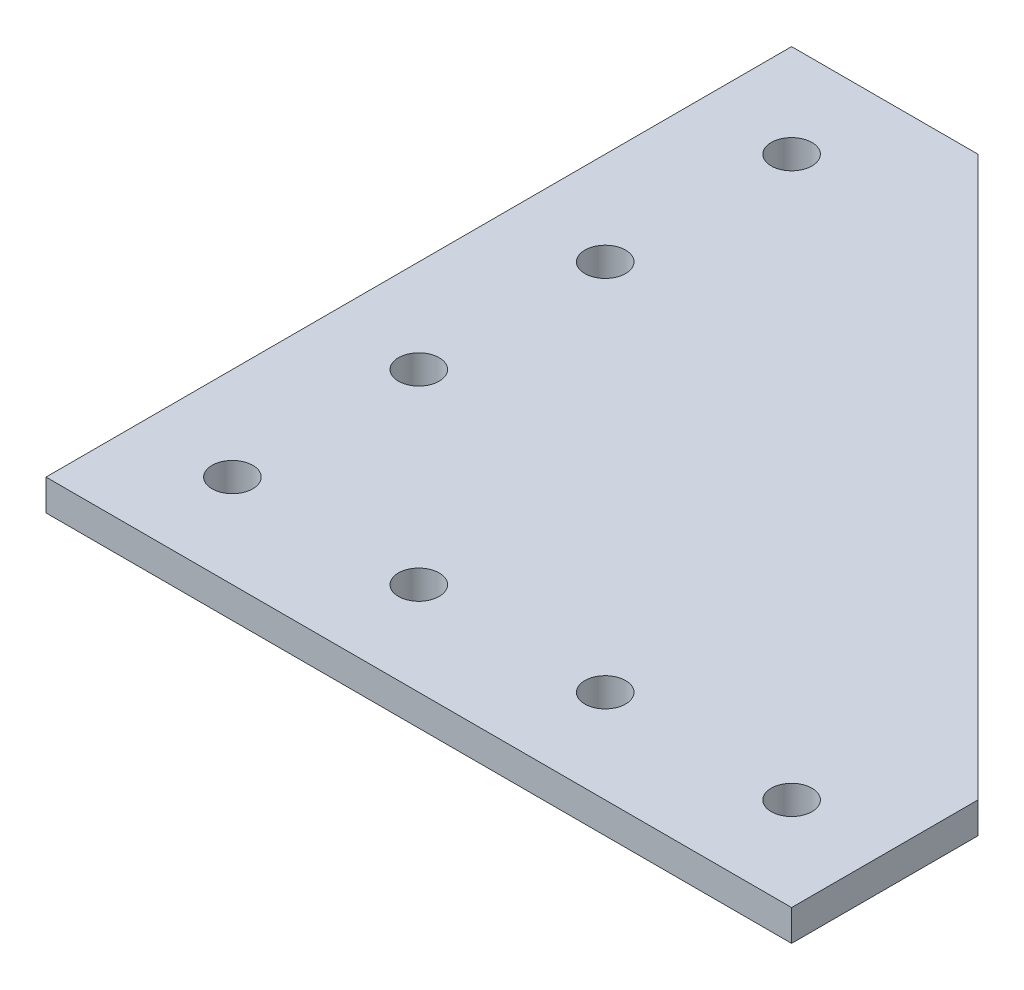
ISO-10303-21;
HEADER;
FILE_DESCRIPTION(('STEP AP214'),'2;1');
FILE_NAME('part.step','',(''),(''),'','','');
FILE_SCHEMA(('AUTOMOTIVE_DESIGN { 1 0 10303 214 1 1 1 1 }'));
ENDSEC;
DATA;
#1=APPLICATION_CONTEXT('core data for automotive mechanical design processes');
#2=APPLICATION_PROTOCOL_DEFINITION('international standard','automotive_design',2000,#1);
#3=PRODUCT_CONTEXT('',#1,'mechanical');
#4=PRODUCT('Part','Part','',(#3));
#5=PRODUCT_RELATED_PRODUCT_CATEGORY('part','',(#4));
#6=PRODUCT_DEFINITION_FORMATION('','',#4);
#7=PRODUCT_DEFINITION_CONTEXT('part definition',#1,'design');
#8=PRODUCT_DEFINITION('design','',#6,#7);
#9=PRODUCT_DEFINITION_SHAPE('','',#8);
#10=(LENGTH_UNIT() NAMED_UNIT(*) SI_UNIT(.MILLI.,.METRE.));
#11=(NAMED_UNIT(*) PLANE_ANGLE_UNIT() SI_UNIT($,.RADIAN.));
#12=(NAMED_UNIT(*) SI_UNIT($,.STERADIAN.) SOLID_ANGLE_UNIT());
#13=UNCERTAINTY_MEASURE_WITH_UNIT(LENGTH_MEASURE(1.E-05),#10,'distance_accuracy_value','');
#14=(GEOMETRIC_REPRESENTATION_CONTEXT(3) GLOBAL_UNCERTAINTY_ASSIGNED_CONTEXT((#13)) GLOBAL_UNIT_ASSIGNED_CONTEXT((#10,
#11,#12)) REPRESENTATION_CONTEXT('',''));
#15=CARTESIAN_POINT('',(0.,0.,0.));
#16=DIRECTION('',(0.,0.,1.));
#17=DIRECTION('',(1.,0.,0.));
#18=AXIS2_PLACEMENT_3D('',#15,#16,#17);
#19=CARTESIAN_POINT('',(0.,6.35,0.));
#20=DIRECTION('',(0.,1.,0.));
#21=DIRECTION('',(0.,0.,1.));
#22=AXIS2_PLACEMENT_3D('',#19,#20,#21);
#23=PLANE('',#22);
#24=CARTESIAN_POINT('',(-8.05206185566881,6.35,28.4768041237114));
#25=DIRECTION('',(0.,1.,0.));
#26=DIRECTION('',(0.,0.,1.));
#27=AXIS2_PLACEMENT_3D('',#24,#25,#26);
#28=CIRCLE('',#27,4.1656);
#29=CARTESIAN_POINT('',(-8.05206185566881,6.35,32.6424041237114));
#30=VERTEX_POINT('',#29);
#31=EDGE_CURVE('E205',#30,#30,#28,.T.);
#32=ORIENTED_EDGE('',*,*,#31,.F.);
#33=EDGE_LOOP('',(#32));
#34=FACE_BOUND('',#33,.T.);
#35=CARTESIAN_POINT('',(-84.2520618556688,6.35,28.4768041237114));
#36=DIRECTION('',(0.,1.,0.));
#37=DIRECTION('',(0.,0.,1.));
#38=AXIS2_PLACEMENT_3D('',#35,#36,#37);
#39=CIRCLE('',#38,4.1656);
#40=CARTESIAN_POINT('',(-84.2520618556688,6.35,32.6424041237114));
#41=VERTEX_POINT('',#40);
#42=EDGE_CURVE('E221',#41,#41,#39,.T.);
#43=ORIENTED_EDGE('',*,*,#42,.F.);
#44=EDGE_LOOP('',(#43));
#45=FACE_BOUND('',#44,.T.);
#46=CARTESIAN_POINT('',(-84.2520618556696,6.35,-47.7231958762887));
#47=DIRECTION('',(0.,1.,0.));
#48=DIRECTION('',(0.,0.,1.));
#49=AXIS2_PLACEMENT_3D('',#46,#47,#48);
#50=CIRCLE('',#49,4.1656);
#51=CARTESIAN_POINT('',(-84.2520618556696,6.35,-43.5575958762887));
#52=VERTEX_POINT('',#51);
#53=EDGE_CURVE('E237',#52,#52,#50,.T.);
#54=ORIENTED_EDGE('',*,*,#53,.F.);
#55=EDGE_LOOP('',(#54));
#56=FACE_BOUND('',#55,.T.);
#57=DIRECTION('',(-1.,0.,0.));
#58=VECTOR('',#57,1.);
#59=CARTESIAN_POINT('',(-65.20206185567,6.35,-104.873195876289));
#60=LINE('',#59,#58);
#61=CARTESIAN_POINT('',(-65.20206185567,6.35,-104.873195876289));
#62=VERTEX_POINT('',#61);
#63=CARTESIAN_POINT('',(-103.30206185567,6.35,-104.873195876289));
#64=VERTEX_POINT('',#63);
#65=EDGE_CURVE('E133',#62,#64,#60,.T.);
#66=ORIENTED_EDGE('',*,*,#65,.T.);
#67=DIRECTION('',(0.,0.,1.));
#68=VECTOR('',#67,1.);
#69=CARTESIAN_POINT('',(-103.30206185567,6.35,-104.873195876289));
#70=LINE('',#69,#68);
#71=CARTESIAN_POINT('',(-103.30206185567,6.35,47.5268041237114));
#72=VERTEX_POINT('',#71);
#73=EDGE_CURVE('E91',#64,#72,#70,.T.);
#74=ORIENTED_EDGE('',*,*,#73,.T.);
#75=DIRECTION('',(1.,0.,0.));
#76=VECTOR('',#75,1.);
#77=CARTESIAN_POINT('',(-103.30206185567,6.35,47.5268041237114));
#78=LINE('',#77,#76);
#79=CARTESIAN_POINT('',(49.09793814433,6.35,47.5268041237114));
#80=VERTEX_POINT('',#79);
#81=EDGE_CURVE('E95',#72,#80,#78,.T.);
#82=ORIENTED_EDGE('',*,*,#81,.T.);
#83=DIRECTION('',(0.,0.,-1.));
#84=VECTOR('',#83,1.);
#85=CARTESIAN_POINT('',(49.09793814433,6.35,47.5268041237114));
#86=LINE('',#85,#84);
#87=CARTESIAN_POINT('',(49.09793814433,6.35,9.42680412371135));
#88=VERTEX_POINT('',#87);
#89=EDGE_CURVE('E99',#80,#88,#86,.T.);
#90=ORIENTED_EDGE('',*,*,#89,.T.);
#91=DIRECTION('',(-0.707106781186548,0.,-0.707106781186548));
#92=VECTOR('',#91,1.);
#93=CARTESIAN_POINT('',(49.09793814433,6.35,9.42680412371135));
#94=LINE('',#93,#92);
#95=EDGE_CURVE('E57',#88,#62,#94,.T.);
#96=ORIENTED_EDGE('',*,*,#95,.T.);
#97=EDGE_LOOP('',(#66,#74,#82,#90,#96));
#98=FACE_BOUND('',#97,.T.);
#99=CARTESIAN_POINT('',(-84.25206185567,6.35,-85.8231958762887));
#100=DIRECTION('',(0.,1.,0.));
#101=DIRECTION('',(0.,0.,1.));
#102=AXIS2_PLACEMENT_3D('',#99,#100,#101);
#103=CIRCLE('',#102,4.1656);
#104=CARTESIAN_POINT('',(-84.25206185567,6.35,-81.6575958762887));
#105=VERTEX_POINT('',#104);
#106=EDGE_CURVE('E124',#105,#105,#103,.T.);
#107=ORIENTED_EDGE('',*,*,#106,.F.);
#108=EDGE_LOOP('',(#107));
#109=FACE_BOUND('',#108,.T.);
#110=CARTESIAN_POINT('',(-84.2520618556692,6.35,-9.62319587628865));
#111=DIRECTION('',(0.,1.,0.));
#112=DIRECTION('',(0.,0.,1.));
#113=AXIS2_PLACEMENT_3D('',#110,#111,#112);
#114=CIRCLE('',#113,4.1656);
#115=CARTESIAN_POINT('',(-84.2520618556692,6.35,-5.45759587628865));
#116=VERTEX_POINT('',#115);
#117=EDGE_CURVE('E229',#116,#116,#114,.T.);
#118=ORIENTED_EDGE('',*,*,#117,.F.);
#119=EDGE_LOOP('',(#118));
#120=FACE_BOUND('',#119,.T.);
#121=CARTESIAN_POINT('',(-46.1520618556688,6.35,28.4768041237114));
#122=DIRECTION('',(0.,1.,0.));
#123=DIRECTION('',(0.,0.,1.));
#124=AXIS2_PLACEMENT_3D('',#121,#122,#123);
#125=CIRCLE('',#124,4.1656);
#126=CARTESIAN_POINT('',(-46.1520618556688,6.35,32.6424041237114));
#127=VERTEX_POINT('',#126);
#128=EDGE_CURVE('E213',#127,#127,#125,.T.);
#129=ORIENTED_EDGE('',*,*,#128,.F.);
#130=EDGE_LOOP('',(#129));
#131=FACE_BOUND('',#130,.T.);
#132=CARTESIAN_POINT('',(30.0479381443312,6.35,28.4768041237114));
#133=DIRECTION('',(0.,1.,0.));
#134=DIRECTION('',(0.,0.,1.));
#135=AXIS2_PLACEMENT_3D('',#132,#133,#134);
#136=CIRCLE('',#135,4.1656);
#137=CARTESIAN_POINT('',(30.0479381443312,6.35,32.6424041237114));
#138=VERTEX_POINT('',#137);
#139=EDGE_CURVE('E194',#138,#138,#136,.T.);
#140=ORIENTED_EDGE('',*,*,#139,.F.);
#141=EDGE_LOOP('',(#140));
#142=FACE_BOUND('',#141,.T.);
#143=ADVANCED_FACE('F39',(#34,#45,#56,#98,#109,#120,#131,#142),#23,.T.);
#144=CARTESIAN_POINT('',(0.,0.,0.));
#145=DIRECTION('',(0.,1.,0.));
#146=DIRECTION('',(0.,0.,1.));
#147=AXIS2_PLACEMENT_3D('',#144,#145,#146);
#148=PLANE('',#147);
#149=DIRECTION('',(-1.,0.,0.));
#150=VECTOR('',#149,1.);
#151=CARTESIAN_POINT('',(-65.20206185567,0.,-104.873195876289));
#152=LINE('',#151,#150);
#153=CARTESIAN_POINT('',(-65.20206185567,0.,-104.873195876289));
#154=VERTEX_POINT('',#153);
#155=CARTESIAN_POINT('',(-103.30206185567,0.,-104.873195876289));
#156=VERTEX_POINT('',#155);
#157=EDGE_CURVE('E119',#154,#156,#152,.T.);
#158=ORIENTED_EDGE('',*,*,#157,.F.);
#159=DIRECTION('',(-0.707106781186548,0.,-0.707106781186548));
#160=VECTOR('',#159,1.);
#161=CARTESIAN_POINT('',(49.09793814433,0.,9.42680412371135));
#162=LINE('',#161,#160);
#163=CARTESIAN_POINT('',(49.09793814433,0.,9.42680412371135));
#164=VERTEX_POINT('',#163);
#165=EDGE_CURVE('E83',#164,#154,#162,.T.);
#166=ORIENTED_EDGE('',*,*,#165,.F.);
#167=DIRECTION('',(0.,0.,-1.));
#168=VECTOR('',#167,1.);
#169=CARTESIAN_POINT('',(49.09793814433,0.,47.5268041237114));
#170=LINE('',#169,#168);
#171=CARTESIAN_POINT('',(49.09793814433,0.,47.5268041237114));
#172=VERTEX_POINT('',#171);
#173=EDGE_CURVE('E77',#172,#164,#170,.T.);
#174=ORIENTED_EDGE('',*,*,#173,.F.);
#175=DIRECTION('',(1.,0.,0.));
#176=VECTOR('',#175,1.);
#177=CARTESIAN_POINT('',(-103.30206185567,0.,47.5268041237114));
#178=LINE('',#177,#176);
#179=CARTESIAN_POINT('',(-103.30206185567,0.,47.5268041237114));
#180=VERTEX_POINT('',#179);
#181=EDGE_CURVE('E107',#180,#172,#178,.T.);
#182=ORIENTED_EDGE('',*,*,#181,.F.);
#183=DIRECTION('',(0.,0.,1.));
#184=VECTOR('',#183,1.);
#185=CARTESIAN_POINT('',(-103.30206185567,0.,-104.873195876289));
#186=LINE('',#185,#184);
#187=EDGE_CURVE('E123',#156,#180,#186,.T.);
#188=ORIENTED_EDGE('',*,*,#187,.F.);
#189=EDGE_LOOP('',(#158,#166,#174,#182,#188));
#190=FACE_BOUND('',#189,.T.);
#191=CARTESIAN_POINT('',(-84.25206185567,0.,-85.8231958762887));
#192=DIRECTION('',(0.,1.,0.));
#193=DIRECTION('',(0.,0.,1.));
#194=AXIS2_PLACEMENT_3D('',#191,#192,#193);
#195=CIRCLE('',#194,4.1656);
#196=CARTESIAN_POINT('',(-84.25206185567,0.,-81.6575958762887));
#197=VERTEX_POINT('',#196);
#198=EDGE_CURVE('E241',#197,#197,#195,.T.);
#199=ORIENTED_EDGE('',*,*,#198,.T.);
#200=EDGE_LOOP('',(#199));
#201=FACE_BOUND('',#200,.T.);
#202=CARTESIAN_POINT('',(-84.2520618556696,0.,-47.7231958762887));
#203=DIRECTION('',(0.,1.,0.));
#204=DIRECTION('',(0.,0.,1.));
#205=AXIS2_PLACEMENT_3D('',#202,#203,#204);
#206=CIRCLE('',#205,4.1656);
#207=CARTESIAN_POINT('',(-84.2520618556696,0.,-43.5575958762887));
#208=VERTEX_POINT('',#207);
#209=EDGE_CURVE('E233',#208,#208,#206,.T.);
#210=ORIENTED_EDGE('',*,*,#209,.T.);
#211=EDGE_LOOP('',(#210));
#212=FACE_BOUND('',#211,.T.);
#213=CARTESIAN_POINT('',(-84.2520618556692,0.,-9.62319587628865));
#214=DIRECTION('',(0.,1.,0.));
#215=DIRECTION('',(0.,0.,1.));
#216=AXIS2_PLACEMENT_3D('',#213,#214,#215);
#217=CIRCLE('',#216,4.1656);
#218=CARTESIAN_POINT('',(-84.2520618556692,0.,-5.45759587628865));
#219=VERTEX_POINT('',#218);
#220=EDGE_CURVE('E225',#219,#219,#217,.T.);
#221=ORIENTED_EDGE('',*,*,#220,.T.);
#222=EDGE_LOOP('',(#221));
#223=FACE_BOUND('',#222,.T.);
#224=CARTESIAN_POINT('',(-84.2520618556688,0.,28.4768041237114));
#225=DIRECTION('',(0.,1.,0.));
#226=DIRECTION('',(0.,0.,1.));
#227=AXIS2_PLACEMENT_3D('',#224,#225,#226);
#228=CIRCLE('',#227,4.1656);
#229=CARTESIAN_POINT('',(-84.2520618556688,0.,32.6424041237114));
#230=VERTEX_POINT('',#229);
#231=EDGE_CURVE('E217',#230,#230,#228,.T.);
#232=ORIENTED_EDGE('',*,*,#231,.T.);
#233=EDGE_LOOP('',(#232));
#234=FACE_BOUND('',#233,.T.);
#235=CARTESIAN_POINT('',(-46.1520618556688,0.,28.4768041237114));
#236=DIRECTION('',(0.,1.,0.));
#237=DIRECTION('',(0.,0.,1.));
#238=AXIS2_PLACEMENT_3D('',#235,#236,#237);
#239=CIRCLE('',#238,4.1656);
#240=CARTESIAN_POINT('',(-46.1520618556688,0.,32.6424041237114));
#241=VERTEX_POINT('',#240);
#242=EDGE_CURVE('E209',#241,#241,#239,.T.);
#243=ORIENTED_EDGE('',*,*,#242,.T.);
#244=EDGE_LOOP('',(#243));
#245=FACE_BOUND('',#244,.T.);
#246=CARTESIAN_POINT('',(-8.05206185566881,0.,28.4768041237114));
#247=DIRECTION('',(0.,1.,0.));
#248=DIRECTION('',(0.,0.,1.));
#249=AXIS2_PLACEMENT_3D('',#246,#247,#248);
#250=CIRCLE('',#249,4.1656);
#251=CARTESIAN_POINT('',(-8.05206185566881,0.,32.6424041237114));
#252=VERTEX_POINT('',#251);
#253=EDGE_CURVE('E202',#252,#252,#250,.T.);
#254=ORIENTED_EDGE('',*,*,#253,.T.);
#255=EDGE_LOOP('',(#254));
#256=FACE_BOUND('',#255,.T.);
#257=CARTESIAN_POINT('',(30.0479381443312,0.,28.4768041237114));
#258=DIRECTION('',(0.,1.,0.));
#259=DIRECTION('',(0.,0.,1.));
#260=AXIS2_PLACEMENT_3D('',#257,#258,#259);
#261=CIRCLE('',#260,4.1656);
#262=CARTESIAN_POINT('',(30.0479381443312,0.,32.6424041237114));
#263=VERTEX_POINT('',#262);
#264=EDGE_CURVE('E197',#263,#263,#261,.T.);
#265=ORIENTED_EDGE('',*,*,#264,.T.);
#266=EDGE_LOOP('',(#265));
#267=FACE_BOUND('',#266,.T.);
#268=ADVANCED_FACE('F140',(#190,#201,#212,#223,#234,#245,#256,#267),#148,.F.);
#269=CARTESIAN_POINT('',(-65.20206185567,6.35,-104.873195876289));
#270=DIRECTION('',(0.,0.,1.));
#271=DIRECTION('',(1.,0.,0.));
#272=AXIS2_PLACEMENT_3D('',#269,#270,#271);
#273=PLANE('',#272);
#274=ORIENTED_EDGE('',*,*,#157,.T.);
#275=DIRECTION('',(0.,-1.,0.));
#276=VECTOR('',#275,1.);
#277=CARTESIAN_POINT('',(-103.30206185567,6.35,-104.873195876289));
#278=LINE('',#277,#276);
#279=EDGE_CURVE('E11',#64,#156,#278,.T.);
#280=ORIENTED_EDGE('',*,*,#279,.F.);
#281=ORIENTED_EDGE('',*,*,#65,.F.);
#282=DIRECTION('',(0.,-1.,0.));
#283=VECTOR('',#282,1.);
#284=CARTESIAN_POINT('',(-65.20206185567,6.35,-104.873195876289));
#285=LINE('',#284,#283);
#286=EDGE_CURVE('E115',#62,#154,#285,.T.);
#287=ORIENTED_EDGE('',*,*,#286,.T.);
#288=EDGE_LOOP('',(#274,#280,#281,#287));
#289=FACE_BOUND('',#288,.T.);
#290=ADVANCED_FACE('F41',(#289),#273,.F.);
#291=CARTESIAN_POINT('',(-103.30206185567,6.35,-104.873195876289));
#292=DIRECTION('',(1.,0.,0.));
#293=DIRECTION('',(0.,0.,-1.));
#294=AXIS2_PLACEMENT_3D('',#291,#292,#293);
#295=PLANE('',#294);
#296=ORIENTED_EDGE('',*,*,#187,.T.);
#297=DIRECTION('',(0.,-1.,0.));
#298=VECTOR('',#297,1.);
#299=CARTESIAN_POINT('',(-103.30206185567,6.35,47.5268041237114));
#300=LINE('',#299,#298);
#301=EDGE_CURVE('E49',#72,#180,#300,.T.);
#302=ORIENTED_EDGE('',*,*,#301,.F.);
#303=ORIENTED_EDGE('',*,*,#73,.F.);
#304=ORIENTED_EDGE('',*,*,#279,.T.);
#305=EDGE_LOOP('',(#296,#302,#303,#304));
#306=FACE_BOUND('',#305,.T.);
#307=ADVANCED_FACE('F322',(#306),#295,.F.);
#308=CARTESIAN_POINT('',(-103.30206185567,6.35,47.5268041237114));
#309=DIRECTION('',(0.,0.,-1.));
#310=DIRECTION('',(-1.,0.,0.));
#311=AXIS2_PLACEMENT_3D('',#308,#309,#310);
#312=PLANE('',#311);
#313=ORIENTED_EDGE('',*,*,#181,.T.);
#314=DIRECTION('',(0.,-1.,0.));
#315=VECTOR('',#314,1.);
#316=CARTESIAN_POINT('',(49.09793814433,6.35,47.5268041237114));
#317=LINE('',#316,#315);
#318=EDGE_CURVE('E104',#80,#172,#317,.T.);
#319=ORIENTED_EDGE('',*,*,#318,.F.);
#320=ORIENTED_EDGE('',*,*,#81,.F.);
#321=ORIENTED_EDGE('',*,*,#301,.T.);
#322=EDGE_LOOP('',(#313,#319,#320,#321));
#323=FACE_BOUND('',#322,.T.);
#324=ADVANCED_FACE('F105',(#323),#312,.F.);
#325=CARTESIAN_POINT('',(49.09793814433,6.35,47.5268041237114));
#326=DIRECTION('',(-1.,0.,0.));
#327=DIRECTION('',(0.,0.,1.));
#328=AXIS2_PLACEMENT_3D('',#325,#326,#327);
#329=PLANE('',#328);
#330=ORIENTED_EDGE('',*,*,#173,.T.);
#331=DIRECTION('',(0.,-1.,0.));
#332=VECTOR('',#331,1.);
#333=CARTESIAN_POINT('',(49.09793814433,6.35,9.42680412371135));
#334=LINE('',#333,#332);
#335=EDGE_CURVE('E109',#88,#164,#334,.T.);
#336=ORIENTED_EDGE('',*,*,#335,.F.);
#337=ORIENTED_EDGE('',*,*,#89,.F.);
#338=ORIENTED_EDGE('',*,*,#318,.T.);
#339=EDGE_LOOP('',(#330,#336,#337,#338));
#340=FACE_BOUND('',#339,.T.);
#341=ADVANCED_FACE('F111',(#340),#329,.F.);
#342=CARTESIAN_POINT('',(49.09793814433,6.35,9.42680412371135));
#343=DIRECTION('',(-0.707106781186548,0.,0.707106781186548));
#344=DIRECTION('',(0.707106781186548,0.,0.707106781186548));
#345=AXIS2_PLACEMENT_3D('',#342,#343,#344);
#346=PLANE('',#345);
#347=ORIENTED_EDGE('',*,*,#165,.T.);
#348=ORIENTED_EDGE('',*,*,#286,.F.);
#349=ORIENTED_EDGE('',*,*,#95,.F.);
#350=ORIENTED_EDGE('',*,*,#335,.T.);
#351=EDGE_LOOP('',(#347,#348,#349,#350));
#352=FACE_BOUND('',#351,.T.);
#353=ADVANCED_FACE('F145',(#352),#346,.F.);
#354=CARTESIAN_POINT('',(-84.25206185567,6.35,-85.8231958762887));
#355=DIRECTION('',(0.,-1.,0.));
#356=DIRECTION('',(0.,0.,-1.));
#357=AXIS2_PLACEMENT_3D('',#354,#355,#356);
#358=CYLINDRICAL_SURFACE('',#357,4.1656);
#359=ORIENTED_EDGE('',*,*,#106,.T.);
#360=EDGE_LOOP('',(#359));
#361=FACE_BOUND('',#360,.T.);
#362=ORIENTED_EDGE('',*,*,#198,.F.);
#363=EDGE_LOOP('',(#362));
#364=FACE_BOUND('',#363,.T.);
#365=ADVANCED_FACE('F147',(#361,#364),#358,.F.);
#366=CARTESIAN_POINT('',(-84.2520618556696,6.35,-47.7231958762887));
#367=DIRECTION('',(0.,-1.,0.));
#368=DIRECTION('',(0.,0.,-1.));
#369=AXIS2_PLACEMENT_3D('',#366,#367,#368);
#370=CYLINDRICAL_SURFACE('',#369,4.1656);
#371=ORIENTED_EDGE('',*,*,#53,.T.);
#372=EDGE_LOOP('',(#371));
#373=FACE_BOUND('',#372,.T.);
#374=ORIENTED_EDGE('',*,*,#209,.F.);
#375=EDGE_LOOP('',(#374));
#376=FACE_BOUND('',#375,.T.);
#377=ADVANCED_FACE('F153',(#373,#376),#370,.F.);
#378=CARTESIAN_POINT('',(-84.2520618556692,6.35,-9.62319587628865));
#379=DIRECTION('',(0.,-1.,0.));
#380=DIRECTION('',(0.,0.,-1.));
#381=AXIS2_PLACEMENT_3D('',#378,#379,#380);
#382=CYLINDRICAL_SURFACE('',#381,4.1656);
#383=ORIENTED_EDGE('',*,*,#117,.T.);
#384=EDGE_LOOP('',(#383));
#385=FACE_BOUND('',#384,.T.);
#386=ORIENTED_EDGE('',*,*,#220,.F.);
#387=EDGE_LOOP('',(#386));
#388=FACE_BOUND('',#387,.T.);
#389=ADVANCED_FACE('F169',(#385,#388),#382,.F.);
#390=CARTESIAN_POINT('',(-84.2520618556688,6.35,28.4768041237114));
#391=DIRECTION('',(0.,-1.,0.));
#392=DIRECTION('',(0.,0.,-1.));
#393=AXIS2_PLACEMENT_3D('',#390,#391,#392);
#394=CYLINDRICAL_SURFACE('',#393,4.1656);
#395=ORIENTED_EDGE('',*,*,#42,.T.);
#396=EDGE_LOOP('',(#395));
#397=FACE_BOUND('',#396,.T.);
#398=ORIENTED_EDGE('',*,*,#231,.F.);
#399=EDGE_LOOP('',(#398));
#400=FACE_BOUND('',#399,.T.);
#401=ADVANCED_FACE('F173',(#397,#400),#394,.F.);
#402=CARTESIAN_POINT('',(-46.1520618556688,6.35,28.4768041237114));
#403=DIRECTION('',(0.,-1.,0.));
#404=DIRECTION('',(0.,0.,-1.));
#405=AXIS2_PLACEMENT_3D('',#402,#403,#404);
#406=CYLINDRICAL_SURFACE('',#405,4.1656);
#407=ORIENTED_EDGE('',*,*,#128,.T.);
#408=EDGE_LOOP('',(#407));
#409=FACE_BOUND('',#408,.T.);
#410=ORIENTED_EDGE('',*,*,#242,.F.);
#411=EDGE_LOOP('',(#410));
#412=FACE_BOUND('',#411,.T.);
#413=ADVANCED_FACE('F177',(#409,#412),#406,.F.);
#414=CARTESIAN_POINT('',(-8.05206185566881,6.35,28.4768041237114));
#415=DIRECTION('',(0.,-1.,0.));
#416=DIRECTION('',(0.,0.,-1.));
#417=AXIS2_PLACEMENT_3D('',#414,#415,#416);
#418=CYLINDRICAL_SURFACE('',#417,4.1656);
#419=ORIENTED_EDGE('',*,*,#31,.T.);
#420=EDGE_LOOP('',(#419));
#421=FACE_BOUND('',#420,.T.);
#422=ORIENTED_EDGE('',*,*,#253,.F.);
#423=EDGE_LOOP('',(#422));
#424=FACE_BOUND('',#423,.T.);
#425=ADVANCED_FACE('F181',(#421,#424),#418,.F.);
#426=CARTESIAN_POINT('',(30.0479381443312,6.35,28.4768041237114));
#427=DIRECTION('',(0.,-1.,0.));
#428=DIRECTION('',(0.,0.,-1.));
#429=AXIS2_PLACEMENT_3D('',#426,#427,#428);
#430=CYLINDRICAL_SURFACE('',#429,4.1656);
#431=ORIENTED_EDGE('',*,*,#139,.T.);
#432=EDGE_LOOP('',(#431));
#433=FACE_BOUND('',#432,.T.);
#434=ORIENTED_EDGE('',*,*,#264,.F.);
#435=EDGE_LOOP('',(#434));
#436=FACE_BOUND('',#435,.T.);
#437=ADVANCED_FACE('F185',(#433,#436),#430,.F.);
#438=CLOSED_SHELL('',(#143,#268,#290,#307,#324,#341,#353,#365,#377,#389,#401,#413,#425,#437));
#439=MANIFOLD_SOLID_BREP('B2',#438);
#440=ADVANCED_BREP_SHAPE_REPRESENTATION('',(#18,#439),#14);
#441=SHAPE_DEFINITION_REPRESENTATION(#9,#440);
ENDSEC;
END-ISO-10303-21;
